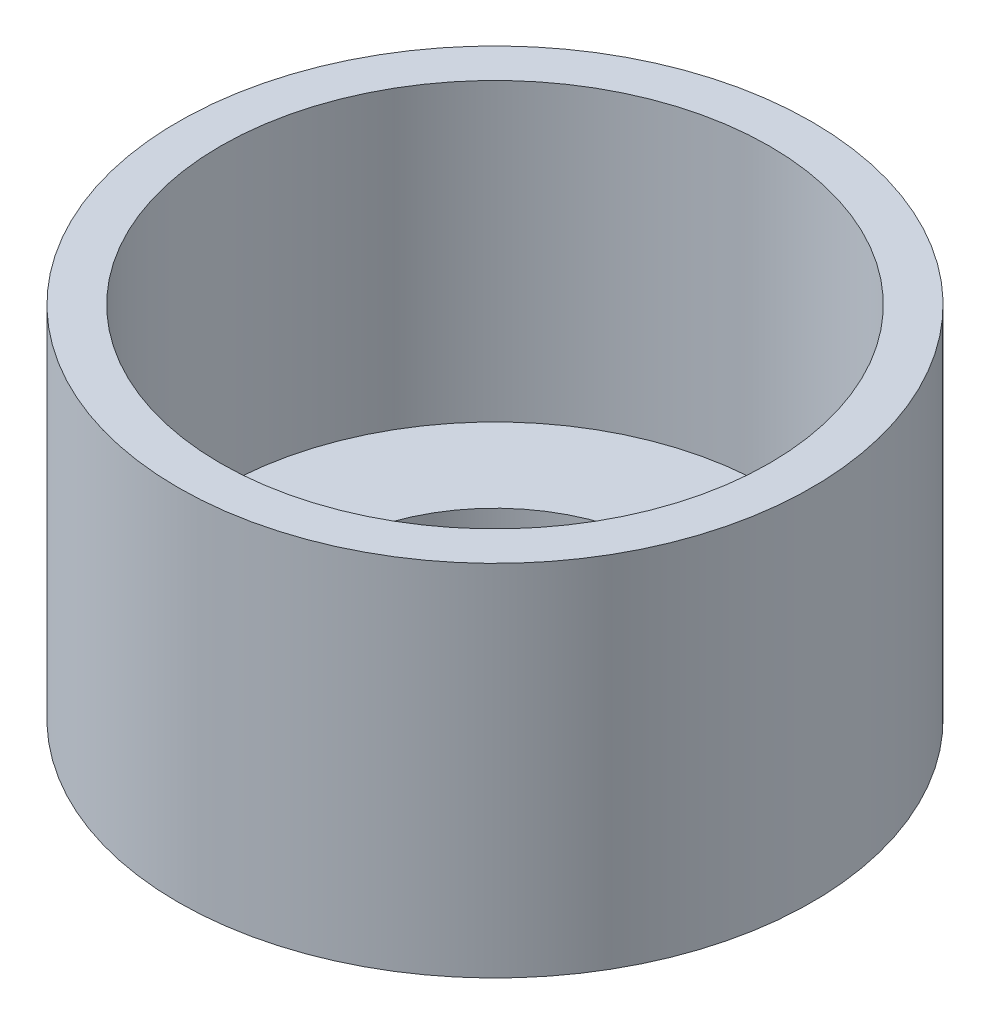
ISO-10303-21;
HEADER;
FILE_DESCRIPTION(('STEP AP214'),'2;1');
FILE_NAME('part.step','',(''),(''),'','','');
FILE_SCHEMA(('AUTOMOTIVE_DESIGN { 1 0 10303 214 1 1 1 1 }'));
ENDSEC;
DATA;
#1=APPLICATION_CONTEXT('core data for automotive mechanical design processes');
#2=APPLICATION_PROTOCOL_DEFINITION('international standard','automotive_design',2000,#1);
#3=PRODUCT_CONTEXT('',#1,'mechanical');
#4=PRODUCT('Part','Part','',(#3));
#5=PRODUCT_RELATED_PRODUCT_CATEGORY('part','',(#4));
#6=PRODUCT_DEFINITION_FORMATION('','',#4);
#7=PRODUCT_DEFINITION_CONTEXT('part definition',#1,'design');
#8=PRODUCT_DEFINITION('design','',#6,#7);
#9=PRODUCT_DEFINITION_SHAPE('','',#8);
#10=(LENGTH_UNIT() NAMED_UNIT(*) SI_UNIT(.MILLI.,.METRE.));
#11=(NAMED_UNIT(*) PLANE_ANGLE_UNIT() SI_UNIT($,.RADIAN.));
#12=(NAMED_UNIT(*) SI_UNIT($,.STERADIAN.) SOLID_ANGLE_UNIT());
#13=UNCERTAINTY_MEASURE_WITH_UNIT(LENGTH_MEASURE(1.E-05),#10,'distance_accuracy_value','');
#14=(GEOMETRIC_REPRESENTATION_CONTEXT(3) GLOBAL_UNCERTAINTY_ASSIGNED_CONTEXT((#13)) GLOBAL_UNIT_ASSIGNED_CONTEXT((#10,
#11,#12)) REPRESENTATION_CONTEXT('',''));
#15=CARTESIAN_POINT('',(0.,0.,0.));
#16=DIRECTION('',(0.,0.,1.));
#17=DIRECTION('',(1.,0.,0.));
#18=AXIS2_PLACEMENT_3D('',#15,#16,#17);
#19=CARTESIAN_POINT('',(0.,3.,0.));
#20=DIRECTION('',(0.,1.,0.));
#21=DIRECTION('',(0.,0.,1.));
#22=AXIS2_PLACEMENT_3D('',#19,#20,#21);
#23=PLANE('',#22);
#24=CARTESIAN_POINT('',(0.,3.,0.));
#25=DIRECTION('',(0.,1.,0.));
#26=DIRECTION('',(0.,0.,1.));
#27=AXIS2_PLACEMENT_3D('',#24,#25,#26);
#28=CIRCLE('',#27,8.);
#29=CARTESIAN_POINT('',(0.,3.,8.));
#30=VERTEX_POINT('',#29);
#31=EDGE_CURVE('E42',#30,#30,#28,.T.);
#32=ORIENTED_EDGE('',*,*,#31,.F.);
#33=EDGE_LOOP('',(#32));
#34=FACE_BOUND('',#33,.T.);
#35=CARTESIAN_POINT('',(0.,3.,0.));
#36=DIRECTION('',(0.,1.,0.));
#37=DIRECTION('',(0.,0.,1.));
#38=AXIS2_PLACEMENT_3D('',#35,#36,#37);
#39=CIRCLE('',#38,13.);
#40=CARTESIAN_POINT('',(0.,3.,13.));
#41=VERTEX_POINT('',#40);
#42=EDGE_CURVE('E10',#41,#41,#39,.F.);
#43=ORIENTED_EDGE('',*,*,#42,.F.);
#44=EDGE_LOOP('',(#43));
#45=FACE_BOUND('',#44,.T.);
#46=ADVANCED_FACE('F31',(#34,#45),#23,.T.);
#47=CARTESIAN_POINT('',(0.,0.,0.));
#48=DIRECTION('',(0.,1.,0.));
#49=DIRECTION('',(0.,0.,1.));
#50=AXIS2_PLACEMENT_3D('',#47,#48,#49);
#51=PLANE('',#50);
#52=CARTESIAN_POINT('',(0.,0.,0.));
#53=DIRECTION('',(0.,1.,0.));
#54=DIRECTION('',(0.,0.,1.));
#55=AXIS2_PLACEMENT_3D('',#52,#53,#54);
#56=CIRCLE('',#55,15.);
#57=CARTESIAN_POINT('',(0.,0.,15.));
#58=VERTEX_POINT('',#57);
#59=EDGE_CURVE('E38',#58,#58,#56,.T.);
#60=ORIENTED_EDGE('',*,*,#59,.F.);
#61=EDGE_LOOP('',(#60));
#62=FACE_BOUND('',#61,.T.);
#63=CARTESIAN_POINT('',(0.,0.,0.));
#64=DIRECTION('',(0.,1.,0.));
#65=DIRECTION('',(0.,0.,1.));
#66=AXIS2_PLACEMENT_3D('',#63,#64,#65);
#67=CIRCLE('',#66,8.);
#68=CARTESIAN_POINT('',(0.,0.,8.));
#69=VERTEX_POINT('',#68);
#70=EDGE_CURVE('E46',#69,#69,#67,.T.);
#71=ORIENTED_EDGE('',*,*,#70,.T.);
#72=EDGE_LOOP('',(#71));
#73=FACE_BOUND('',#72,.T.);
#74=ADVANCED_FACE('F73',(#62,#73),#51,.F.);
#75=CARTESIAN_POINT('',(0.,3.,0.));
#76=DIRECTION('',(0.,-1.,0.));
#77=DIRECTION('',(0.,0.,-1.));
#78=AXIS2_PLACEMENT_3D('',#75,#76,#77);
#79=CYLINDRICAL_SURFACE('',#78,15.);
#80=ORIENTED_EDGE('',*,*,#59,.T.);
#81=EDGE_LOOP('',(#80));
#82=FACE_BOUND('',#81,.T.);
#83=CARTESIAN_POINT('',(0.,17.,0.));
#84=DIRECTION('',(0.,1.,0.));
#85=DIRECTION('',(0.,0.,1.));
#86=AXIS2_PLACEMENT_3D('',#83,#84,#85);
#87=CIRCLE('',#86,15.);
#88=CARTESIAN_POINT('',(0.,17.,15.));
#89=VERTEX_POINT('',#88);
#90=EDGE_CURVE('E50',#89,#89,#87,.T.);
#91=ORIENTED_EDGE('',*,*,#90,.F.);
#92=EDGE_LOOP('',(#91));
#93=FACE_BOUND('',#92,.T.);
#94=ADVANCED_FACE('F33',(#82,#93),#79,.T.);
#95=CARTESIAN_POINT('',(0.,3.,0.));
#96=DIRECTION('',(0.,-1.,0.));
#97=DIRECTION('',(0.,0.,-1.));
#98=AXIS2_PLACEMENT_3D('',#95,#96,#97);
#99=CYLINDRICAL_SURFACE('',#98,8.);
#100=ORIENTED_EDGE('',*,*,#31,.T.);
#101=EDGE_LOOP('',(#100));
#102=FACE_BOUND('',#101,.T.);
#103=ORIENTED_EDGE('',*,*,#70,.F.);
#104=EDGE_LOOP('',(#103));
#105=FACE_BOUND('',#104,.T.);
#106=ADVANCED_FACE('F62',(#102,#105),#99,.F.);
#107=CARTESIAN_POINT('',(0.,17.,0.));
#108=DIRECTION('',(0.,1.,0.));
#109=DIRECTION('',(0.,0.,1.));
#110=AXIS2_PLACEMENT_3D('',#107,#108,#109);
#111=PLANE('',#110);
#112=ORIENTED_EDGE('',*,*,#90,.T.);
#113=EDGE_LOOP('',(#112));
#114=FACE_BOUND('',#113,.T.);
#115=CARTESIAN_POINT('',(0.,17.,0.));
#116=DIRECTION('',(0.,1.,0.));
#117=DIRECTION('',(0.,0.,1.));
#118=AXIS2_PLACEMENT_3D('',#115,#116,#117);
#119=CIRCLE('',#118,13.);
#120=CARTESIAN_POINT('',(0.,17.,13.));
#121=VERTEX_POINT('',#120);
#122=EDGE_CURVE('E54',#121,#121,#119,.T.);
#123=ORIENTED_EDGE('',*,*,#122,.F.);
#124=EDGE_LOOP('',(#123));
#125=FACE_BOUND('',#124,.T.);
#126=ADVANCED_FACE('F60',(#114,#125),#111,.T.);
#127=CARTESIAN_POINT('',(0.,17.,0.));
#128=DIRECTION('',(0.,-1.,0.));
#129=DIRECTION('',(0.,0.,-1.));
#130=AXIS2_PLACEMENT_3D('',#127,#128,#129);
#131=CYLINDRICAL_SURFACE('',#130,13.);
#132=ORIENTED_EDGE('',*,*,#122,.T.);
#133=EDGE_LOOP('',(#132));
#134=FACE_BOUND('',#133,.T.);
#135=ORIENTED_EDGE('',*,*,#42,.T.);
#136=EDGE_LOOP('',(#135));
#137=FACE_BOUND('',#136,.T.);
#138=ADVANCED_FACE('F58',(#134,#137),#131,.F.);
#139=CLOSED_SHELL('',(#46,#74,#94,#106,#126,#138));
#140=MANIFOLD_SOLID_BREP('B2',#139);
#141=ADVANCED_BREP_SHAPE_REPRESENTATION('',(#18,#140),#14);
#142=SHAPE_DEFINITION_REPRESENTATION(#9,#141);
ENDSEC;
END-ISO-10303-21;
